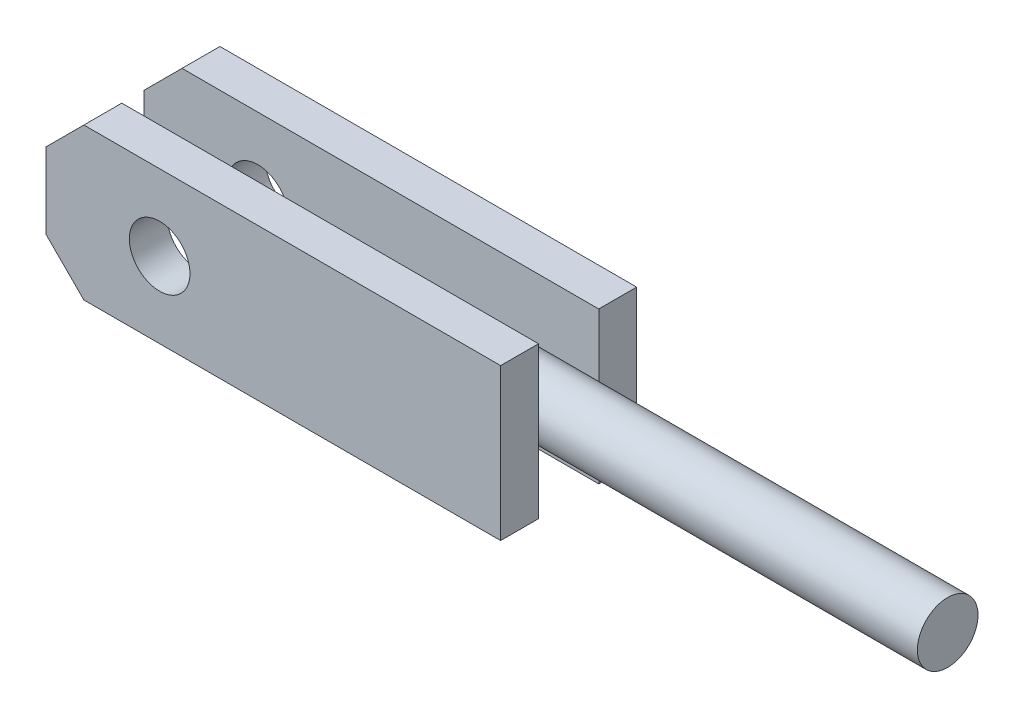
ISO-10303-21;
HEADER;
FILE_DESCRIPTION(('STEP AP214'),'2;1');
FILE_NAME('part.step','',(''),(''),'','','');
FILE_SCHEMA(('AUTOMOTIVE_DESIGN { 1 0 10303 214 1 1 1 1 }'));
ENDSEC;
DATA;
#1=APPLICATION_CONTEXT('core data for automotive mechanical design processes');
#2=APPLICATION_PROTOCOL_DEFINITION('international standard','automotive_design',2000,#1);
#3=PRODUCT_CONTEXT('',#1,'mechanical');
#4=PRODUCT('Part','Part','',(#3));
#5=PRODUCT_RELATED_PRODUCT_CATEGORY('part','',(#4));
#6=PRODUCT_DEFINITION_FORMATION('','',#4);
#7=PRODUCT_DEFINITION_CONTEXT('part definition',#1,'design');
#8=PRODUCT_DEFINITION('design','',#6,#7);
#9=PRODUCT_DEFINITION_SHAPE('','',#8);
#10=(LENGTH_UNIT() NAMED_UNIT(*) SI_UNIT(.MILLI.,.METRE.));
#11=(NAMED_UNIT(*) PLANE_ANGLE_UNIT() SI_UNIT($,.RADIAN.));
#12=(NAMED_UNIT(*) SI_UNIT($,.STERADIAN.) SOLID_ANGLE_UNIT());
#13=UNCERTAINTY_MEASURE_WITH_UNIT(LENGTH_MEASURE(1.E-05),#10,'distance_accuracy_value','');
#14=(GEOMETRIC_REPRESENTATION_CONTEXT(3) GLOBAL_UNCERTAINTY_ASSIGNED_CONTEXT((#13)) GLOBAL_UNIT_ASSIGNED_CONTEXT((#10,
#11,#12)) REPRESENTATION_CONTEXT('',''));
#15=CARTESIAN_POINT('',(0.,0.,0.));
#16=DIRECTION('',(0.,0.,1.));
#17=DIRECTION('',(1.,0.,0.));
#18=AXIS2_PLACEMENT_3D('',#15,#16,#17);
#19=CARTESIAN_POINT('',(40.,0.,-8.00000000000067));
#20=DIRECTION('',(1.,0.,0.));
#21=DIRECTION('',(0.,0.,-1.));
#22=AXIS2_PLACEMENT_3D('',#19,#20,#21);
#23=CYLINDRICAL_SURFACE('',#22,8.);
#24=DIRECTION('',(1.,0.,0.));
#25=VECTOR('',#24,1.);
#26=CARTESIAN_POINT('',(40.,-1.2609520212918,-15.9000000000007));
#27=LINE('',#26,#25);
#28=CARTESIAN_POINT('',(59.9999999999999,-1.26095202129176,-15.8999999999994));
#29=VERTEX_POINT('',#28);
#30=CARTESIAN_POINT('',(40.,-1.2609520212918,-15.9000000000007));
#31=VERTEX_POINT('',#30);
#32=EDGE_CURVE('E153',#29,#31,#27,.F.);
#33=ORIENTED_EDGE('',*,*,#32,.F.);
#34=CARTESIAN_POINT('',(59.9999999999999,1.80411241501588E-13,-7.99999999999934));
#35=DIRECTION('',(-1.,0.,0.));
#36=DIRECTION('',(0.,0.,1.));
#37=AXIS2_PLACEMENT_3D('',#34,#35,#36);
#38=CIRCLE('',#37,8.);
#39=CARTESIAN_POINT('',(59.9999999999999,1.26095202129202,-15.8999999999994));
#40=VERTEX_POINT('',#39);
#41=EDGE_CURVE('E134',#29,#40,#38,.F.);
#42=ORIENTED_EDGE('',*,*,#41,.T.);
#43=DIRECTION('',(1.,0.,0.));
#44=VECTOR('',#43,1.);
#45=CARTESIAN_POINT('',(40.0000000000001,1.26095202129203,-15.9000000000007));
#46=LINE('',#45,#44);
#47=CARTESIAN_POINT('',(40.0000000000001,1.26095202129203,-15.9000000000007));
#48=VERTEX_POINT('',#47);
#49=EDGE_CURVE('E128',#48,#40,#46,.T.);
#50=ORIENTED_EDGE('',*,*,#49,.F.);
#51=CARTESIAN_POINT('',(40.,0.,-8.00000000000067));
#52=DIRECTION('',(1.,0.,0.));
#53=DIRECTION('',(0.,0.,-1.));
#54=AXIS2_PLACEMENT_3D('',#51,#52,#53);
#55=CIRCLE('',#54,8.);
#56=EDGE_CURVE('E158',#48,#31,#55,.T.);
#57=ORIENTED_EDGE('',*,*,#56,.T.);
#58=EDGE_LOOP('',(#33,#42,#50,#57));
#59=FACE_BOUND('',#58,.T.);
#60=CARTESIAN_POINT('',(160.,0.,-7.99999999999934));
#61=DIRECTION('',(1.,0.,0.));
#62=DIRECTION('',(0.,0.,-1.));
#63=AXIS2_PLACEMENT_3D('',#60,#61,#62);
#64=CIRCLE('',#63,8.);
#65=CARTESIAN_POINT('',(160.,1.23789867245705E-13,-15.9999999999993));
#66=VERTEX_POINT('',#65);
#67=EDGE_CURVE('E155',#66,#66,#64,.T.);
#68=ORIENTED_EDGE('',*,*,#67,.F.);
#69=EDGE_LOOP('',(#68));
#70=FACE_BOUND('',#69,.T.);
#71=ADVANCED_FACE('F44',(#59,#70),#23,.T.);
#72=CARTESIAN_POINT('',(40.,0.,-8.00000000000067));
#73=DIRECTION('',(1.,0.,0.));
#74=DIRECTION('',(0.,0.,-1.));
#75=AXIS2_PLACEMENT_3D('',#72,#73,#74);
#76=PLANE('',#75);
#77=ORIENTED_EDGE('',*,*,#56,.F.);
#78=DIRECTION('',(0.,-1.,0.));
#79=VECTOR('',#78,1.);
#80=CARTESIAN_POINT('',(40.0000000000001,1.2490009027033E-13,-15.9000000000007));
#81=LINE('',#80,#79);
#82=EDGE_CURVE('E161',#48,#31,#81,.T.);
#83=ORIENTED_EDGE('',*,*,#82,.T.);
#84=EDGE_LOOP('',(#77,#83));
#85=FACE_BOUND('',#84,.T.);
#86=ADVANCED_FACE('F208',(#85),#76,.F.);
#87=CARTESIAN_POINT('',(160.,0.,-7.99999999999934));
#88=DIRECTION('',(1.,0.,0.));
#89=DIRECTION('',(0.,0.,-1.));
#90=AXIS2_PLACEMENT_3D('',#87,#88,#89);
#91=PLANE('',#90);
#92=ORIENTED_EDGE('',*,*,#67,.T.);
#93=EDGE_LOOP('',(#92));
#94=FACE_BOUND('',#93,.T.);
#95=ADVANCED_FACE('F214',(#94),#91,.T.);
#96=CARTESIAN_POINT('',(-60.0000000000002,-19.9999999999999,-15.9));
#97=DIRECTION('',(0.999999999999999,0.,0.));
#98=DIRECTION('',(0.,0.999999999999999,0.));
#99=AXIS2_PLACEMENT_3D('',#96,#97,#98);
#100=PLANE('',#99);
#101=DIRECTION('',(0.,-0.999999999999999,0.));
#102=VECTOR('',#101,1.);
#103=CARTESIAN_POINT('',(-59.9999999999997,-19.9999999999999,-25.9));
#104=LINE('',#103,#102);
#105=CARTESIAN_POINT('',(-59.9999999999999,9.99999999999995,-25.9));
#106=VERTEX_POINT('',#105);
#107=CARTESIAN_POINT('',(-59.9999999999997,-9.99999999999982,-25.9));
#108=VERTEX_POINT('',#107);
#109=EDGE_CURVE('E141',#106,#108,#104,.T.);
#110=ORIENTED_EDGE('',*,*,#109,.T.);
#111=DIRECTION('',(0.,0.,1.));
#112=VECTOR('',#111,1.);
#113=CARTESIAN_POINT('',(-60.,-9.9999999999998,-15.9));
#114=LINE('',#113,#112);
#115=CARTESIAN_POINT('',(-60.,-9.9999999999998,-15.9));
#116=VERTEX_POINT('',#115);
#117=EDGE_CURVE('E52',#108,#116,#114,.T.);
#118=ORIENTED_EDGE('',*,*,#117,.T.);
#119=DIRECTION('',(0.,-0.999999999999999,0.));
#120=VECTOR('',#119,1.);
#121=CARTESIAN_POINT('',(-60.0000000000002,-19.9999999999999,-15.9));
#122=LINE('',#121,#120);
#123=CARTESIAN_POINT('',(-60.0000000000002,10.0000000000001,-15.9));
#124=VERTEX_POINT('',#123);
#125=EDGE_CURVE('E120',#124,#116,#122,.T.);
#126=ORIENTED_EDGE('',*,*,#125,.F.);
#127=DIRECTION('',(0.,0.,-1.));
#128=VECTOR('',#127,1.);
#129=CARTESIAN_POINT('',(-60.0000000000002,10.0000000000001,-15.9));
#130=LINE('',#129,#128);
#131=EDGE_CURVE('E165',#124,#106,#130,.T.);
#132=ORIENTED_EDGE('',*,*,#131,.T.);
#133=EDGE_LOOP('',(#110,#118,#126,#132));
#134=FACE_BOUND('',#133,.T.);
#135=ADVANCED_FACE('F188',(#134),#100,.F.);
#136=CARTESIAN_POINT('',(60.,-19.9999999999999,-15.9000000000007));
#137=DIRECTION('',(0.,1.,0.));
#138=DIRECTION('',(-1.,0.,0.));
#139=AXIS2_PLACEMENT_3D('',#136,#137,#138);
#140=PLANE('',#139);
#141=DIRECTION('',(0.999999999999999,0.,0.));
#142=VECTOR('',#141,1.);
#143=CARTESIAN_POINT('',(60.,-19.9999999999999,-15.9000000000007));
#144=LINE('',#143,#142);
#145=CARTESIAN_POINT('',(-50.0000000000001,-19.9999999999999,-15.9));
#146=VERTEX_POINT('',#145);
#147=CARTESIAN_POINT('',(60.,-19.9999999999999,-15.9000000000007));
#148=VERTEX_POINT('',#147);
#149=EDGE_CURVE('E109',#146,#148,#144,.T.);
#150=ORIENTED_EDGE('',*,*,#149,.F.);
#151=DIRECTION('',(0.,0.,-1.));
#152=VECTOR('',#151,1.);
#153=CARTESIAN_POINT('',(-50.0000000000001,-19.9999999999999,-15.9));
#154=LINE('',#153,#152);
#155=CARTESIAN_POINT('',(-49.9999999999998,-19.9999999999999,-25.9));
#156=VERTEX_POINT('',#155);
#157=EDGE_CURVE('E174',#146,#156,#154,.T.);
#158=ORIENTED_EDGE('',*,*,#157,.T.);
#159=DIRECTION('',(0.999999999999999,0.,0.));
#160=VECTOR('',#159,1.);
#161=CARTESIAN_POINT('',(60.,-19.9999999999999,-25.9000000000007));
#162=LINE('',#161,#160);
#163=CARTESIAN_POINT('',(60.,-19.9999999999999,-25.9000000000007));
#164=VERTEX_POINT('',#163);
#165=EDGE_CURVE('E125',#156,#164,#162,.T.);
#166=ORIENTED_EDGE('',*,*,#165,.T.);
#167=DIRECTION('',(0.,0.,-1.));
#168=VECTOR('',#167,1.);
#169=CARTESIAN_POINT('',(60.,-19.9999999999999,-15.9000000000007));
#170=LINE('',#169,#168);
#171=EDGE_CURVE('E123',#148,#164,#170,.T.);
#172=ORIENTED_EDGE('',*,*,#171,.F.);
#173=EDGE_LOOP('',(#150,#158,#166,#172));
#174=FACE_BOUND('',#173,.T.);
#175=ADVANCED_FACE('F124',(#174),#140,.F.);
#176=CARTESIAN_POINT('',(60.,-19.9999999999999,-15.9000000000007));
#177=DIRECTION('',(-1.,0.,0.));
#178=DIRECTION('',(0.,0.,1.));
#179=AXIS2_PLACEMENT_3D('',#176,#177,#178);
#180=PLANE('',#179);
#181=ORIENTED_EDGE('',*,*,#41,.F.);
#182=DIRECTION('',(0.,1.,0.));
#183=VECTOR('',#182,1.);
#184=CARTESIAN_POINT('',(60.,-19.9999999999999,-15.9000000000007));
#185=LINE('',#184,#183);
#186=EDGE_CURVE('E113',#148,#29,#185,.T.);
#187=ORIENTED_EDGE('',*,*,#186,.F.);
#188=ORIENTED_EDGE('',*,*,#171,.T.);
#189=DIRECTION('',(0.,1.,0.));
#190=VECTOR('',#189,1.);
#191=CARTESIAN_POINT('',(60.,-19.9999999999999,-25.9000000000007));
#192=LINE('',#191,#190);
#193=CARTESIAN_POINT('',(59.9999999999999,20.0000000000001,-25.8999999999994));
#194=VERTEX_POINT('',#193);
#195=EDGE_CURVE('E145',#164,#194,#192,.T.);
#196=ORIENTED_EDGE('',*,*,#195,.T.);
#197=DIRECTION('',(0.,0.,-1.));
#198=VECTOR('',#197,1.);
#199=CARTESIAN_POINT('',(59.9999999999999,20.0000000000001,-15.8999999999994));
#200=LINE('',#199,#198);
#201=CARTESIAN_POINT('',(59.9999999999999,20.0000000000001,-15.8999999999994));
#202=VERTEX_POINT('',#201);
#203=EDGE_CURVE('E129',#202,#194,#200,.T.);
#204=ORIENTED_EDGE('',*,*,#203,.F.);
#205=EDGE_CURVE('E119',#40,#202,#185,.T.);
#206=ORIENTED_EDGE('',*,*,#205,.F.);
#207=EDGE_LOOP('',(#181,#187,#188,#196,#204,#206));
#208=FACE_BOUND('',#207,.T.);
#209=ADVANCED_FACE('F131',(#208),#180,.F.);
#210=CARTESIAN_POINT('',(59.9999999999999,20.0000000000001,-15.8999999999994));
#211=DIRECTION('',(0.,-1.,0.));
#212=DIRECTION('',(1.,0.,0.));
#213=AXIS2_PLACEMENT_3D('',#210,#211,#212);
#214=PLANE('',#213);
#215=DIRECTION('',(-1.,0.,0.));
#216=VECTOR('',#215,1.);
#217=CARTESIAN_POINT('',(59.9999999999999,20.0000000000001,-25.8999999999994));
#218=LINE('',#217,#216);
#219=CARTESIAN_POINT('',(-49.9999999999997,20.,-25.9000000000007));
#220=VERTEX_POINT('',#219);
#221=EDGE_CURVE('E147',#194,#220,#218,.T.);
#222=ORIENTED_EDGE('',*,*,#221,.T.);
#223=DIRECTION('',(0.,0.,1.));
#224=VECTOR('',#223,1.);
#225=CARTESIAN_POINT('',(-49.9999999999999,20.0000000000001,-15.9000000000007));
#226=LINE('',#225,#224);
#227=CARTESIAN_POINT('',(-49.9999999999999,20.0000000000001,-15.9000000000007));
#228=VERTEX_POINT('',#227);
#229=EDGE_CURVE('E170',#220,#228,#226,.T.);
#230=ORIENTED_EDGE('',*,*,#229,.T.);
#231=DIRECTION('',(-1.,0.,0.));
#232=VECTOR('',#231,1.);
#233=CARTESIAN_POINT('',(59.9999999999999,20.0000000000001,-15.8999999999994));
#234=LINE('',#233,#232);
#235=EDGE_CURVE('E135',#202,#228,#234,.T.);
#236=ORIENTED_EDGE('',*,*,#235,.F.);
#237=ORIENTED_EDGE('',*,*,#203,.T.);
#238=EDGE_LOOP('',(#222,#230,#236,#237));
#239=FACE_BOUND('',#238,.T.);
#240=ADVANCED_FACE('F182',(#239),#214,.F.);
#241=CARTESIAN_POINT('',(0.,0.,-15.9));
#242=DIRECTION('',(0.,0.,1.));
#243=DIRECTION('',(1.,0.,0.));
#244=AXIS2_PLACEMENT_3D('',#241,#242,#243);
#245=PLANE('',#244);
#246=CARTESIAN_POINT('',(-30.0000000000001,1.38777878078145E-13,-15.9));
#247=DIRECTION('',(0.,0.,1.));
#248=DIRECTION('',(1.,0.,0.));
#249=AXIS2_PLACEMENT_3D('',#246,#247,#248);
#250=CIRCLE('',#249,8.);
#251=CARTESIAN_POINT('',(-22.0000000000001,1.38777878078145E-13,-15.9));
#252=VERTEX_POINT('',#251);
#253=EDGE_CURVE('E143',#252,#252,#250,.T.);
#254=ORIENTED_EDGE('',*,*,#253,.F.);
#255=EDGE_LOOP('',(#254));
#256=FACE_BOUND('',#255,.T.);
#257=ORIENTED_EDGE('',*,*,#125,.T.);
#258=DIRECTION('',(-0.707106781186546,0.707106781186549,0.));
#259=VECTOR('',#258,1.);
#260=CARTESIAN_POINT('',(-35.0000000000003,-34.9999999999998,-15.9));
#261=LINE('',#260,#259);
#262=EDGE_CURVE('E12',#116,#146,#261,.F.);
#263=ORIENTED_EDGE('',*,*,#262,.T.);
#264=ORIENTED_EDGE('',*,*,#149,.T.);
#265=ORIENTED_EDGE('',*,*,#186,.T.);
#266=ORIENTED_EDGE('',*,*,#32,.T.);
#267=ORIENTED_EDGE('',*,*,#82,.F.);
#268=ORIENTED_EDGE('',*,*,#49,.T.);
#269=ORIENTED_EDGE('',*,*,#205,.T.);
#270=ORIENTED_EDGE('',*,*,#235,.T.);
#271=DIRECTION('',(0.707106781186548,0.707106781186547,0.));
#272=VECTOR('',#271,1.);
#273=CARTESIAN_POINT('',(-35.0000000000001,35.0000000000001,-15.9000000000007));
#274=LINE('',#273,#272);
#275=EDGE_CURVE('E172',#228,#124,#274,.F.);
#276=ORIENTED_EDGE('',*,*,#275,.T.);
#277=EDGE_LOOP('',(#257,#263,#264,#265,#266,#267,#268,#269,#270,#276));
#278=FACE_BOUND('',#277,.T.);
#279=ADVANCED_FACE('F111',(#256,#278),#245,.T.);
#280=CARTESIAN_POINT('',(1.66533453693773E-13,0.,-25.9));
#281=DIRECTION('',(0.,0.,1.));
#282=DIRECTION('',(1.,0.,0.));
#283=AXIS2_PLACEMENT_3D('',#280,#281,#282);
#284=PLANE('',#283);
#285=CARTESIAN_POINT('',(-29.9999999999999,0.,-25.9));
#286=DIRECTION('',(0.,0.,-1.));
#287=DIRECTION('',(-1.,0.,0.));
#288=AXIS2_PLACEMENT_3D('',#285,#286,#287);
#289=CIRCLE('',#288,8.);
#290=CARTESIAN_POINT('',(-37.9999999999999,0.,-25.9));
#291=VERTEX_POINT('',#290);
#292=EDGE_CURVE('E192',#291,#291,#289,.T.);
#293=ORIENTED_EDGE('',*,*,#292,.F.);
#294=EDGE_LOOP('',(#293));
#295=FACE_BOUND('',#294,.T.);
#296=ORIENTED_EDGE('',*,*,#165,.F.);
#297=DIRECTION('',(0.707106781186546,-0.707106781186549,0.));
#298=VECTOR('',#297,1.);
#299=CARTESIAN_POINT('',(-49.9999999999998,-19.9999999999999,-25.9));
#300=LINE('',#299,#298);
#301=EDGE_CURVE('E66',#156,#108,#300,.F.);
#302=ORIENTED_EDGE('',*,*,#301,.T.);
#303=ORIENTED_EDGE('',*,*,#109,.F.);
#304=DIRECTION('',(-0.707106781186548,-0.707106781186547,0.));
#305=VECTOR('',#304,1.);
#306=CARTESIAN_POINT('',(-59.9999999999999,9.99999999999995,-25.9));
#307=LINE('',#306,#305);
#308=EDGE_CURVE('E168',#106,#220,#307,.F.);
#309=ORIENTED_EDGE('',*,*,#308,.T.);
#310=ORIENTED_EDGE('',*,*,#221,.F.);
#311=ORIENTED_EDGE('',*,*,#195,.F.);
#312=EDGE_LOOP('',(#296,#302,#303,#309,#310,#311));
#313=FACE_BOUND('',#312,.T.);
#314=ADVANCED_FACE('F177',(#295,#313),#284,.F.);
#315=CARTESIAN_POINT('',(-60.0000000000002,10.0000000000001,-15.9));
#316=DIRECTION('',(0.707106781186547,-0.707106781186548,0.));
#317=DIRECTION('',(0.,0.,-1.));
#318=AXIS2_PLACEMENT_3D('',#315,#316,#317);
#319=PLANE('',#318);
#320=ORIENTED_EDGE('',*,*,#275,.F.);
#321=ORIENTED_EDGE('',*,*,#229,.F.);
#322=ORIENTED_EDGE('',*,*,#308,.F.);
#323=ORIENTED_EDGE('',*,*,#131,.F.);
#324=EDGE_LOOP('',(#320,#321,#322,#323));
#325=FACE_BOUND('',#324,.T.);
#326=ADVANCED_FACE('F187',(#325),#319,.F.);
#327=CARTESIAN_POINT('',(-50.0000000000001,-19.9999999999999,-15.9));
#328=DIRECTION('',(0.707106781186549,0.707106781186546,0.));
#329=DIRECTION('',(0.,0.,-1.));
#330=AXIS2_PLACEMENT_3D('',#327,#328,#329);
#331=PLANE('',#330);
#332=ORIENTED_EDGE('',*,*,#262,.F.);
#333=ORIENTED_EDGE('',*,*,#117,.F.);
#334=ORIENTED_EDGE('',*,*,#301,.F.);
#335=ORIENTED_EDGE('',*,*,#157,.F.);
#336=EDGE_LOOP('',(#332,#333,#334,#335));
#337=FACE_BOUND('',#336,.T.);
#338=ADVANCED_FACE('F46',(#337),#331,.F.);
#339=CARTESIAN_POINT('',(-30.,-2.22044604925031E-13,74.1000000000001));
#340=DIRECTION('',(0.,0.,-1.));
#341=DIRECTION('',(-1.,0.,0.));
#342=AXIS2_PLACEMENT_3D('',#339,#340,#341);
#343=CYLINDRICAL_SURFACE('',#342,8.);
#344=ORIENTED_EDGE('',*,*,#253,.T.);
#345=EDGE_LOOP('',(#344));
#346=FACE_BOUND('',#345,.T.);
#347=ORIENTED_EDGE('',*,*,#292,.T.);
#348=EDGE_LOOP('',(#347));
#349=FACE_BOUND('',#348,.T.);
#350=ADVANCED_FACE('F196',(#346,#349),#343,.F.);
#351=CLOSED_SHELL('',(#71,#86,#95,#135,#175,#209,#240,#279,#314,#326,#338,#350));
#352=MANIFOLD_SOLID_BREP('B2',#351);
#353=CARTESIAN_POINT('',(-60.0000000000002,-19.9999999999999,10.));
#354=DIRECTION('',(0.999999999999999,0.,0.));
#355=DIRECTION('',(0.,0.999999999999999,0.));
#356=AXIS2_PLACEMENT_3D('',#353,#354,#355);
#357=PLANE('',#356);
#358=DIRECTION('',(0.,-0.999999999999999,0.));
#359=VECTOR('',#358,1.);
#360=CARTESIAN_POINT('',(-60.0000000000002,-19.9999999999999,0.));
#361=LINE('',#360,#359);
#362=CARTESIAN_POINT('',(-60.0000000000002,9.99999999999998,0.));
#363=VERTEX_POINT('',#362);
#364=CARTESIAN_POINT('',(-60.,-9.99999999999988,0.));
#365=VERTEX_POINT('',#364);
#366=EDGE_CURVE('E364',#363,#365,#361,.T.);
#367=ORIENTED_EDGE('',*,*,#366,.T.);
#368=DIRECTION('',(0.,0.,1.));
#369=VECTOR('',#368,1.);
#370=CARTESIAN_POINT('',(-60.,-9.99999999999988,10.));
#371=LINE('',#370,#369);
#372=CARTESIAN_POINT('',(-60.,-9.99999999999988,10.));
#373=VERTEX_POINT('',#372);
#374=EDGE_CURVE('E290',#365,#373,#371,.T.);
#375=ORIENTED_EDGE('',*,*,#374,.T.);
#376=DIRECTION('',(0.,-0.999999999999999,0.));
#377=VECTOR('',#376,1.);
#378=CARTESIAN_POINT('',(-60.0000000000002,-19.9999999999999,10.));
#379=LINE('',#378,#377);
#380=CARTESIAN_POINT('',(-60.0000000000002,9.99999999999998,10.));
#381=VERTEX_POINT('',#380);
#382=EDGE_CURVE('E345',#381,#373,#379,.T.);
#383=ORIENTED_EDGE('',*,*,#382,.F.);
#384=DIRECTION('',(0.,0.,-1.));
#385=VECTOR('',#384,1.);
#386=CARTESIAN_POINT('',(-60.0000000000002,9.99999999999998,10.));
#387=LINE('',#386,#385);
#388=EDGE_CURVE('E353',#381,#363,#387,.T.);
#389=ORIENTED_EDGE('',*,*,#388,.T.);
#390=EDGE_LOOP('',(#367,#375,#383,#389));
#391=FACE_BOUND('',#390,.T.);
#392=ADVANCED_FACE('F282',(#391),#357,.F.);
#393=CARTESIAN_POINT('',(60.,-20.,9.99999999999934));
#394=DIRECTION('',(0.,1.,0.));
#395=DIRECTION('',(-1.,0.,0.));
#396=AXIS2_PLACEMENT_3D('',#393,#394,#395);
#397=PLANE('',#396);
#398=DIRECTION('',(0.999999999999999,0.,0.));
#399=VECTOR('',#398,1.);
#400=CARTESIAN_POINT('',(60.,-20.,9.99999999999934));
#401=LINE('',#400,#399);
#402=CARTESIAN_POINT('',(-50.0000000000001,-20.,10.));
#403=VERTEX_POINT('',#402);
#404=CARTESIAN_POINT('',(60.,-20.,9.99999999999934));
#405=VERTEX_POINT('',#404);
#406=EDGE_CURVE('E334',#403,#405,#401,.T.);
#407=ORIENTED_EDGE('',*,*,#406,.F.);
#408=DIRECTION('',(0.,0.,-1.));
#409=VECTOR('',#408,1.);
#410=CARTESIAN_POINT('',(-50.0000000000001,-20.,10.));
#411=LINE('',#410,#409);
#412=CARTESIAN_POINT('',(-50.0000000000001,-20.,0.));
#413=VERTEX_POINT('',#412);
#414=EDGE_CURVE('E382',#403,#413,#411,.T.);
#415=ORIENTED_EDGE('',*,*,#414,.T.);
#416=DIRECTION('',(0.999999999999999,0.,0.));
#417=VECTOR('',#416,1.);
#418=CARTESIAN_POINT('',(60.,-20.,-6.66133814775094E-13));
#419=LINE('',#418,#417);
#420=CARTESIAN_POINT('',(60.,-20.,-6.66133814775094E-13));
#421=VERTEX_POINT('',#420);
#422=EDGE_CURVE('E350',#413,#421,#419,.T.);
#423=ORIENTED_EDGE('',*,*,#422,.T.);
#424=DIRECTION('',(0.,0.,-1.));
#425=VECTOR('',#424,1.);
#426=CARTESIAN_POINT('',(60.,-20.,9.99999999999934));
#427=LINE('',#426,#425);
#428=EDGE_CURVE('E348',#405,#421,#427,.T.);
#429=ORIENTED_EDGE('',*,*,#428,.F.);
#430=EDGE_LOOP('',(#407,#415,#423,#429));
#431=FACE_BOUND('',#430,.T.);
#432=ADVANCED_FACE('F349',(#431),#397,.F.);
#433=CARTESIAN_POINT('',(60.,-20.,9.99999999999934));
#434=DIRECTION('',(-1.,0.,0.));
#435=DIRECTION('',(0.,0.,1.));
#436=AXIS2_PLACEMENT_3D('',#433,#434,#435);
#437=PLANE('',#436);
#438=DIRECTION('',(0.,1.,0.));
#439=VECTOR('',#438,1.);
#440=CARTESIAN_POINT('',(60.,-20.,-6.66133814775094E-13));
#441=LINE('',#440,#439);
#442=CARTESIAN_POINT('',(60.0000000000001,20.,6.66133814775094E-13));
#443=VERTEX_POINT('',#442);
#444=EDGE_CURVE('E368',#421,#443,#441,.T.);
#445=ORIENTED_EDGE('',*,*,#444,.T.);
#446=DIRECTION('',(0.,0.,-1.));
#447=VECTOR('',#446,1.);
#448=CARTESIAN_POINT('',(60.0000000000001,20.,10.0000000000007));
#449=LINE('',#448,#447);
#450=CARTESIAN_POINT('',(60.0000000000001,20.,10.0000000000007));
#451=VERTEX_POINT('',#450);
#452=EDGE_CURVE('E354',#451,#443,#449,.T.);
#453=ORIENTED_EDGE('',*,*,#452,.F.);
#454=DIRECTION('',(0.,1.,0.));
#455=VECTOR('',#454,1.);
#456=CARTESIAN_POINT('',(60.,-20.,9.99999999999934));
#457=LINE('',#456,#455);
#458=EDGE_CURVE('E339',#405,#451,#457,.T.);
#459=ORIENTED_EDGE('',*,*,#458,.F.);
#460=ORIENTED_EDGE('',*,*,#428,.T.);
#461=EDGE_LOOP('',(#445,#453,#459,#460));
#462=FACE_BOUND('',#461,.T.);
#463=ADVANCED_FACE('F356',(#462),#437,.F.);
#464=CARTESIAN_POINT('',(60.0000000000001,20.,10.0000000000007));
#465=DIRECTION('',(0.,-1.,0.));
#466=DIRECTION('',(1.,0.,0.));
#467=AXIS2_PLACEMENT_3D('',#464,#465,#466);
#468=PLANE('',#467);
#469=DIRECTION('',(-1.,0.,0.));
#470=VECTOR('',#469,1.);
#471=CARTESIAN_POINT('',(60.0000000000001,20.,6.66133814775094E-13));
#472=LINE('',#471,#470);
#473=CARTESIAN_POINT('',(-49.9999999999999,20.,-6.66133814775094E-13));
#474=VERTEX_POINT('',#473);
#475=EDGE_CURVE('E370',#443,#474,#472,.T.);
#476=ORIENTED_EDGE('',*,*,#475,.T.);
#477=DIRECTION('',(0.,0.,1.));
#478=VECTOR('',#477,1.);
#479=CARTESIAN_POINT('',(-49.9999999999999,20.,9.99999999999934));
#480=LINE('',#479,#478);
#481=CARTESIAN_POINT('',(-49.9999999999999,20.,9.99999999999934));
#482=VERTEX_POINT('',#481);
#483=EDGE_CURVE('E378',#474,#482,#480,.T.);
#484=ORIENTED_EDGE('',*,*,#483,.T.);
#485=DIRECTION('',(-1.,0.,0.));
#486=VECTOR('',#485,1.);
#487=CARTESIAN_POINT('',(60.0000000000001,20.,10.0000000000007));
#488=LINE('',#487,#486);
#489=EDGE_CURVE('E359',#451,#482,#488,.T.);
#490=ORIENTED_EDGE('',*,*,#489,.F.);
#491=ORIENTED_EDGE('',*,*,#452,.T.);
#492=EDGE_LOOP('',(#476,#484,#490,#491));
#493=FACE_BOUND('',#492,.T.);
#494=ADVANCED_FACE('F388',(#493),#468,.F.);
#495=CARTESIAN_POINT('',(0.,0.,10.));
#496=DIRECTION('',(0.,0.,1.));
#497=DIRECTION('',(1.,0.,0.));
#498=AXIS2_PLACEMENT_3D('',#495,#496,#497);
#499=PLANE('',#498);
#500=CARTESIAN_POINT('',(-30.0000000000001,0.,10.));
#501=DIRECTION('',(0.,0.,1.));
#502=DIRECTION('',(1.,0.,0.));
#503=AXIS2_PLACEMENT_3D('',#500,#501,#502);
#504=CIRCLE('',#503,8.);
#505=CARTESIAN_POINT('',(-22.0000000000001,0.,10.));
#506=VERTEX_POINT('',#505);
#507=EDGE_CURVE('E395',#506,#506,#504,.T.);
#508=ORIENTED_EDGE('',*,*,#507,.F.);
#509=EDGE_LOOP('',(#508));
#510=FACE_BOUND('',#509,.T.);
#511=ORIENTED_EDGE('',*,*,#382,.T.);
#512=DIRECTION('',(-0.707106781186546,0.707106781186549,0.));
#513=VECTOR('',#512,1.);
#514=CARTESIAN_POINT('',(-35.0000000000002,-34.9999999999999,10.));
#515=LINE('',#514,#513);
#516=EDGE_CURVE('E42',#373,#403,#515,.F.);
#517=ORIENTED_EDGE('',*,*,#516,.T.);
#518=ORIENTED_EDGE('',*,*,#406,.T.);
#519=ORIENTED_EDGE('',*,*,#458,.T.);
#520=ORIENTED_EDGE('',*,*,#489,.T.);
#521=DIRECTION('',(0.707106781186549,0.707106781186546,0.));
#522=VECTOR('',#521,1.);
#523=CARTESIAN_POINT('',(-35.,35.,9.99999999999934));
#524=LINE('',#523,#522);
#525=EDGE_CURVE('E380',#482,#381,#524,.F.);
#526=ORIENTED_EDGE('',*,*,#525,.T.);
#527=EDGE_LOOP('',(#511,#517,#518,#519,#520,#526));
#528=FACE_BOUND('',#527,.T.);
#529=ADVANCED_FACE('F336',(#510,#528),#499,.T.);
#530=CARTESIAN_POINT('',(0.,0.,0.));
#531=DIRECTION('',(0.,0.,1.));
#532=DIRECTION('',(1.,0.,0.));
#533=AXIS2_PLACEMENT_3D('',#530,#531,#532);
#534=PLANE('',#533);
#535=CARTESIAN_POINT('',(-30.0000000000001,0.,0.));
#536=DIRECTION('',(0.,0.,1.));
#537=DIRECTION('',(1.,0.,0.));
#538=AXIS2_PLACEMENT_3D('',#535,#536,#537);
#539=CIRCLE('',#538,8.);
#540=CARTESIAN_POINT('',(-22.0000000000001,0.,0.));
#541=VERTEX_POINT('',#540);
#542=EDGE_CURVE('E366',#541,#541,#539,.T.);
#543=ORIENTED_EDGE('',*,*,#542,.T.);
#544=EDGE_LOOP('',(#543));
#545=FACE_BOUND('',#544,.T.);
#546=ORIENTED_EDGE('',*,*,#422,.F.);
#547=DIRECTION('',(0.707106781186546,-0.707106781186549,0.));
#548=VECTOR('',#547,1.);
#549=CARTESIAN_POINT('',(-50.0000000000001,-20.,0.));
#550=LINE('',#549,#548);
#551=EDGE_CURVE('E304',#413,#365,#550,.F.);
#552=ORIENTED_EDGE('',*,*,#551,.T.);
#553=ORIENTED_EDGE('',*,*,#366,.F.);
#554=DIRECTION('',(-0.707106781186549,-0.707106781186546,0.));
#555=VECTOR('',#554,1.);
#556=CARTESIAN_POINT('',(-60.0000000000002,9.99999999999998,0.));
#557=LINE('',#556,#555);
#558=EDGE_CURVE('E376',#363,#474,#557,.F.);
#559=ORIENTED_EDGE('',*,*,#558,.T.);
#560=ORIENTED_EDGE('',*,*,#475,.F.);
#561=ORIENTED_EDGE('',*,*,#444,.F.);
#562=EDGE_LOOP('',(#546,#552,#553,#559,#560,#561));
#563=FACE_BOUND('',#562,.T.);
#564=ADVANCED_FACE('F385',(#545,#563),#534,.F.);
#565=CARTESIAN_POINT('',(-30.0000000000001,0.,0.));
#566=DIRECTION('',(0.,0.,1.));
#567=DIRECTION('',(1.,0.,0.));
#568=AXIS2_PLACEMENT_3D('',#565,#566,#567);
#569=CYLINDRICAL_SURFACE('',#568,8.);
#570=ORIENTED_EDGE('',*,*,#542,.F.);
#571=EDGE_LOOP('',(#570));
#572=FACE_BOUND('',#571,.T.);
#573=ORIENTED_EDGE('',*,*,#507,.T.);
#574=EDGE_LOOP('',(#573));
#575=FACE_BOUND('',#574,.T.);
#576=ADVANCED_FACE('F402',(#572,#575),#569,.F.);
#577=CARTESIAN_POINT('',(-60.0000000000002,9.99999999999998,10.));
#578=DIRECTION('',(0.707106781186546,-0.707106781186549,0.));
#579=DIRECTION('',(0.,0.,-1.));
#580=AXIS2_PLACEMENT_3D('',#577,#578,#579);
#581=PLANE('',#580);
#582=ORIENTED_EDGE('',*,*,#525,.F.);
#583=ORIENTED_EDGE('',*,*,#483,.F.);
#584=ORIENTED_EDGE('',*,*,#558,.F.);
#585=ORIENTED_EDGE('',*,*,#388,.F.);
#586=EDGE_LOOP('',(#582,#583,#584,#585));
#587=FACE_BOUND('',#586,.T.);
#588=ADVANCED_FACE('F393',(#587),#581,.F.);
#589=CARTESIAN_POINT('',(-50.0000000000001,-20.,10.));
#590=DIRECTION('',(0.707106781186549,0.707106781186546,0.));
#591=DIRECTION('',(0.,0.,-1.));
#592=AXIS2_PLACEMENT_3D('',#589,#590,#591);
#593=PLANE('',#592);
#594=ORIENTED_EDGE('',*,*,#516,.F.);
#595=ORIENTED_EDGE('',*,*,#374,.F.);
#596=ORIENTED_EDGE('',*,*,#551,.F.);
#597=ORIENTED_EDGE('',*,*,#414,.F.);
#598=EDGE_LOOP('',(#594,#595,#596,#597));
#599=FACE_BOUND('',#598,.T.);
#600=ADVANCED_FACE('F284',(#599),#593,.F.);
#601=CLOSED_SHELL('',(#392,#432,#463,#494,#529,#564,#576,#588,#600));
#602=MANIFOLD_SOLID_BREP('B6',#601);
#603=ADVANCED_BREP_SHAPE_REPRESENTATION('',(#18,#352,#602),#14);
#604=SHAPE_DEFINITION_REPRESENTATION(#9,#603);
ENDSEC;
END-ISO-10303-21;
